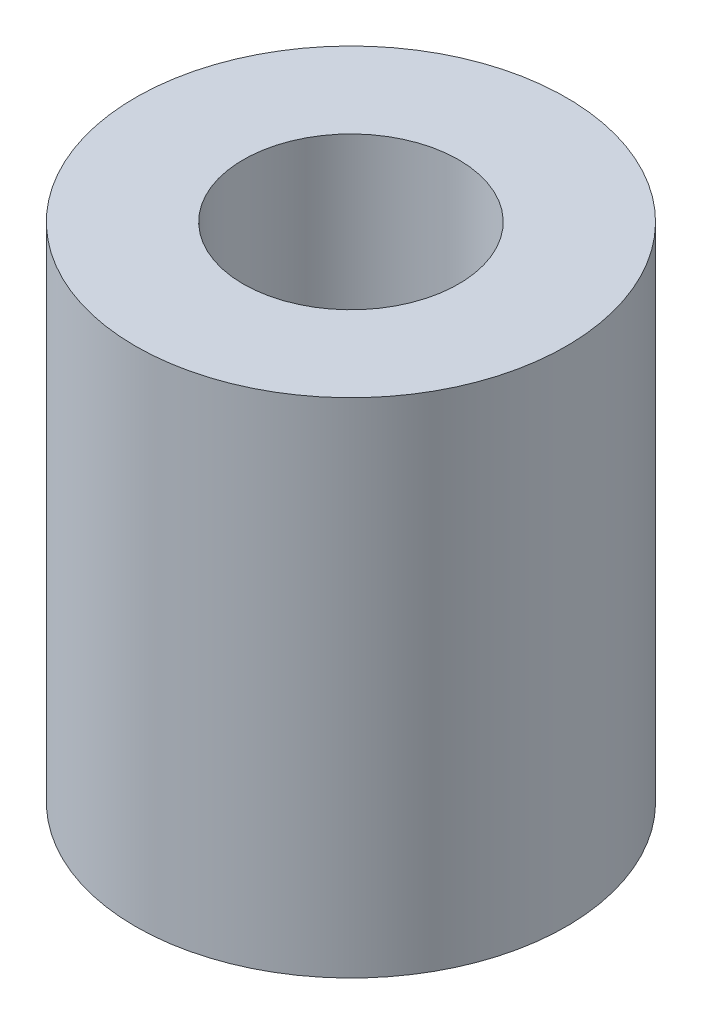
ISO-10303-21;
HEADER;
FILE_DESCRIPTION(('STEP AP214'),'2;1');
FILE_NAME('part.step','',(''),(''),'','','');
FILE_SCHEMA(('AUTOMOTIVE_DESIGN { 1 0 10303 214 1 1 1 1 }'));
ENDSEC;
DATA;
#1=APPLICATION_CONTEXT('core data for automotive mechanical design processes');
#2=APPLICATION_PROTOCOL_DEFINITION('international standard','automotive_design',2000,#1);
#3=PRODUCT_CONTEXT('',#1,'mechanical');
#4=PRODUCT('Part','Part','',(#3));
#5=PRODUCT_RELATED_PRODUCT_CATEGORY('part','',(#4));
#6=PRODUCT_DEFINITION_FORMATION('','',#4);
#7=PRODUCT_DEFINITION_CONTEXT('part definition',#1,'design');
#8=PRODUCT_DEFINITION('design','',#6,#7);
#9=PRODUCT_DEFINITION_SHAPE('','',#8);
#10=(LENGTH_UNIT() NAMED_UNIT(*) SI_UNIT(.MILLI.,.METRE.));
#11=(NAMED_UNIT(*) PLANE_ANGLE_UNIT() SI_UNIT($,.RADIAN.));
#12=(NAMED_UNIT(*) SI_UNIT($,.STERADIAN.) SOLID_ANGLE_UNIT());
#13=UNCERTAINTY_MEASURE_WITH_UNIT(LENGTH_MEASURE(1.E-05),#10,'distance_accuracy_value','');
#14=(GEOMETRIC_REPRESENTATION_CONTEXT(3) GLOBAL_UNCERTAINTY_ASSIGNED_CONTEXT((#13)) GLOBAL_UNIT_ASSIGNED_CONTEXT((#10,
#11,#12)) REPRESENTATION_CONTEXT('',''));
#15=CARTESIAN_POINT('',(0.,0.,0.));
#16=DIRECTION('',(0.,0.,1.));
#17=DIRECTION('',(1.,0.,0.));
#18=AXIS2_PLACEMENT_3D('',#15,#16,#17);
#19=CARTESIAN_POINT('',(0.,7.,0.));
#20=DIRECTION('',(0.,1.,0.));
#21=DIRECTION('',(0.,0.,1.));
#22=AXIS2_PLACEMENT_3D('',#19,#20,#21);
#23=PLANE('',#22);
#24=CARTESIAN_POINT('',(0.,7.,0.));
#25=DIRECTION('',(0.,1.,0.));
#26=DIRECTION('',(0.,0.,1.));
#27=AXIS2_PLACEMENT_3D('',#24,#25,#26);
#28=CIRCLE('',#27,3.);
#29=CARTESIAN_POINT('',(0.,7.,3.));
#30=VERTEX_POINT('',#29);
#31=EDGE_CURVE('E10',#30,#30,#28,.T.);
#32=ORIENTED_EDGE('',*,*,#31,.T.);
#33=EDGE_LOOP('',(#32));
#34=FACE_BOUND('',#33,.T.);
#35=CARTESIAN_POINT('',(0.,7.,0.));
#36=DIRECTION('',(0.,1.,0.));
#37=DIRECTION('',(0.,0.,1.));
#38=AXIS2_PLACEMENT_3D('',#35,#36,#37);
#39=CIRCLE('',#38,1.5);
#40=CARTESIAN_POINT('',(0.,7.,1.5));
#41=VERTEX_POINT('',#40);
#42=EDGE_CURVE('E44',#41,#41,#39,.T.);
#43=ORIENTED_EDGE('',*,*,#42,.F.);
#44=EDGE_LOOP('',(#43));
#45=FACE_BOUND('',#44,.T.);
#46=ADVANCED_FACE('F33',(#34,#45),#23,.T.);
#47=CARTESIAN_POINT('',(0.,0.,0.));
#48=DIRECTION('',(0.,1.,0.));
#49=DIRECTION('',(0.,0.,1.));
#50=AXIS2_PLACEMENT_3D('',#47,#48,#49);
#51=PLANE('',#50);
#52=CARTESIAN_POINT('',(0.,0.,0.));
#53=DIRECTION('',(0.,1.,0.));
#54=DIRECTION('',(0.,0.,1.));
#55=AXIS2_PLACEMENT_3D('',#52,#53,#54);
#56=CIRCLE('',#55,3.);
#57=CARTESIAN_POINT('',(0.,0.,3.));
#58=VERTEX_POINT('',#57);
#59=EDGE_CURVE('E37',#58,#58,#56,.T.);
#60=ORIENTED_EDGE('',*,*,#59,.F.);
#61=EDGE_LOOP('',(#60));
#62=FACE_BOUND('',#61,.T.);
#63=CARTESIAN_POINT('',(0.,0.,0.));
#64=DIRECTION('',(0.,1.,0.));
#65=DIRECTION('',(0.,0.,1.));
#66=AXIS2_PLACEMENT_3D('',#63,#64,#65);
#67=CIRCLE('',#66,1.5);
#68=CARTESIAN_POINT('',(0.,0.,1.5));
#69=VERTEX_POINT('',#68);
#70=EDGE_CURVE('E46',#69,#69,#67,.T.);
#71=ORIENTED_EDGE('',*,*,#70,.T.);
#72=EDGE_LOOP('',(#71));
#73=FACE_BOUND('',#72,.T.);
#74=ADVANCED_FACE('F56',(#62,#73),#51,.F.);
#75=CARTESIAN_POINT('',(0.,7.,0.));
#76=DIRECTION('',(0.,-1.,0.));
#77=DIRECTION('',(0.,0.,-1.));
#78=AXIS2_PLACEMENT_3D('',#75,#76,#77);
#79=CYLINDRICAL_SURFACE('',#78,3.);
#80=ORIENTED_EDGE('',*,*,#31,.F.);
#81=EDGE_LOOP('',(#80));
#82=FACE_BOUND('',#81,.T.);
#83=ORIENTED_EDGE('',*,*,#59,.T.);
#84=EDGE_LOOP('',(#83));
#85=FACE_BOUND('',#84,.T.);
#86=ADVANCED_FACE('F35',(#82,#85),#79,.T.);
#87=CARTESIAN_POINT('',(0.,7.,0.));
#88=DIRECTION('',(0.,-1.,0.));
#89=DIRECTION('',(0.,0.,-1.));
#90=AXIS2_PLACEMENT_3D('',#87,#88,#89);
#91=CYLINDRICAL_SURFACE('',#90,1.5);
#92=ORIENTED_EDGE('',*,*,#42,.T.);
#93=EDGE_LOOP('',(#92));
#94=FACE_BOUND('',#93,.T.);
#95=ORIENTED_EDGE('',*,*,#70,.F.);
#96=EDGE_LOOP('',(#95));
#97=FACE_BOUND('',#96,.T.);
#98=ADVANCED_FACE('F52',(#94,#97),#91,.F.);
#99=CLOSED_SHELL('',(#46,#74,#86,#98));
#100=MANIFOLD_SOLID_BREP('B2',#99);
#101=ADVANCED_BREP_SHAPE_REPRESENTATION('',(#18,#100),#14);
#102=SHAPE_DEFINITION_REPRESENTATION(#9,#101);
ENDSEC;
END-ISO-10303-21;
